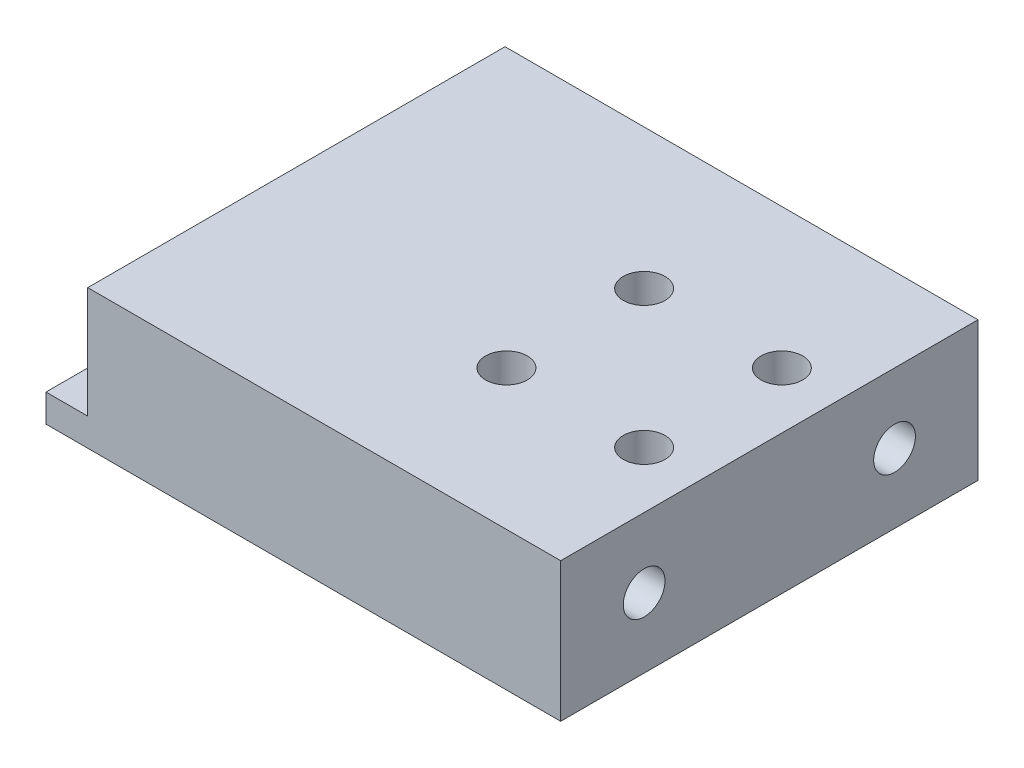
ISO-10303-21;
HEADER;
FILE_DESCRIPTION(('STEP AP214'),'2;1');
FILE_NAME('part.step','',(''),(''),'','','');
FILE_SCHEMA(('AUTOMOTIVE_DESIGN { 1 0 10303 214 1 1 1 1 }'));
ENDSEC;
DATA;
#1=APPLICATION_CONTEXT('core data for automotive mechanical design processes');
#2=APPLICATION_PROTOCOL_DEFINITION('international standard','automotive_design',2000,#1);
#3=PRODUCT_CONTEXT('',#1,'mechanical');
#4=PRODUCT('Part','Part','',(#3));
#5=PRODUCT_RELATED_PRODUCT_CATEGORY('part','',(#4));
#6=PRODUCT_DEFINITION_FORMATION('','',#4);
#7=PRODUCT_DEFINITION_CONTEXT('part definition',#1,'design');
#8=PRODUCT_DEFINITION('design','',#6,#7);
#9=PRODUCT_DEFINITION_SHAPE('','',#8);
#10=(LENGTH_UNIT() NAMED_UNIT(*) SI_UNIT(.MILLI.,.METRE.));
#11=(NAMED_UNIT(*) PLANE_ANGLE_UNIT() SI_UNIT($,.RADIAN.));
#12=(NAMED_UNIT(*) SI_UNIT($,.STERADIAN.) SOLID_ANGLE_UNIT());
#13=UNCERTAINTY_MEASURE_WITH_UNIT(LENGTH_MEASURE(1.E-05),#10,'distance_accuracy_value','');
#14=(GEOMETRIC_REPRESENTATION_CONTEXT(3) GLOBAL_UNCERTAINTY_ASSIGNED_CONTEXT((#13)) GLOBAL_UNIT_ASSIGNED_CONTEXT((#10,
#11,#12)) REPRESENTATION_CONTEXT('',''));
#15=CARTESIAN_POINT('',(0.,0.,0.));
#16=DIRECTION('',(0.,0.,1.));
#17=DIRECTION('',(1.,0.,0.));
#18=AXIS2_PLACEMENT_3D('',#15,#16,#17);
#19=CARTESIAN_POINT('',(0.,10.,0.));
#20=DIRECTION('',(0.,-1.,0.));
#21=DIRECTION('',(0.,0.,-1.));
#22=AXIS2_PLACEMENT_3D('',#19,#20,#21);
#23=PLANE('',#22);
#24=CARTESIAN_POINT('',(23.0502525316942,10.,-10.0502525316941));
#25=DIRECTION('',(0.,1.,0.));
#26=DIRECTION('',(0.,0.,1.));
#27=AXIS2_PLACEMENT_3D('',#24,#25,#26);
#28=CIRCLE('',#27,1.50000000000001);
#29=CARTESIAN_POINT('',(23.0502525316942,10.,-8.55025253169413));
#30=VERTEX_POINT('',#29);
#31=EDGE_CURVE('E160',#30,#30,#28,.T.);
#32=ORIENTED_EDGE('',*,*,#31,.F.);
#33=EDGE_LOOP('',(#32));
#34=FACE_BOUND('',#33,.T.);
#35=CARTESIAN_POINT('',(32.9497474683059,10.,-10.0502525316942));
#36=DIRECTION('',(0.,1.,0.));
#37=DIRECTION('',(0.,0.,1.));
#38=AXIS2_PLACEMENT_3D('',#35,#36,#37);
#39=CIRCLE('',#38,1.49999999999992);
#40=CARTESIAN_POINT('',(32.9497474683059,10.,-8.55025253169427));
#41=VERTEX_POINT('',#40);
#42=EDGE_CURVE('E166',#41,#41,#39,.T.);
#43=ORIENTED_EDGE('',*,*,#42,.F.);
#44=EDGE_LOOP('',(#43));
#45=FACE_BOUND('',#44,.T.);
#46=CARTESIAN_POINT('',(23.0502525316941,10.,-19.9497474683058));
#47=DIRECTION('',(0.,1.,0.));
#48=DIRECTION('',(0.,0.,1.));
#49=AXIS2_PLACEMENT_3D('',#46,#47,#48);
#50=CIRCLE('',#49,1.5);
#51=CARTESIAN_POINT('',(23.0502525316941,10.,-18.4497474683058));
#52=VERTEX_POINT('',#51);
#53=EDGE_CURVE('E172',#52,#52,#50,.T.);
#54=ORIENTED_EDGE('',*,*,#53,.F.);
#55=EDGE_LOOP('',(#54));
#56=FACE_BOUND('',#55,.T.);
#57=CARTESIAN_POINT('',(32.9497474683058,10.,-19.9497474683059));
#58=DIRECTION('',(0.,1.,0.));
#59=DIRECTION('',(0.,0.,1.));
#60=AXIS2_PLACEMENT_3D('',#57,#58,#59);
#61=CIRCLE('',#60,1.5);
#62=CARTESIAN_POINT('',(32.9497474683058,10.,-18.4497474683059));
#63=VERTEX_POINT('',#62);
#64=EDGE_CURVE('E107',#63,#63,#61,.T.);
#65=ORIENTED_EDGE('',*,*,#64,.F.);
#66=EDGE_LOOP('',(#65));
#67=FACE_BOUND('',#66,.T.);
#68=DIRECTION('',(0.,0.,-1.));
#69=VECTOR('',#68,1.);
#70=CARTESIAN_POINT('',(3.,10.,-30.));
#71=LINE('',#70,#69);
#72=CARTESIAN_POINT('',(3.,10.,0.));
#73=VERTEX_POINT('',#72);
#74=CARTESIAN_POINT('',(3.,10.,-30.));
#75=VERTEX_POINT('',#74);
#76=EDGE_CURVE('E52',#73,#75,#71,.T.);
#77=ORIENTED_EDGE('',*,*,#76,.F.);
#78=DIRECTION('',(1.,0.,0.));
#79=VECTOR('',#78,1.);
#80=CARTESIAN_POINT('',(0.,10.,0.));
#81=LINE('',#80,#79);
#82=CARTESIAN_POINT('',(37.,10.,0.));
#83=VERTEX_POINT('',#82);
#84=EDGE_CURVE('E100',#73,#83,#81,.T.);
#85=ORIENTED_EDGE('',*,*,#84,.T.);
#86=DIRECTION('',(0.,0.,-1.));
#87=VECTOR('',#86,1.);
#88=CARTESIAN_POINT('',(37.,10.,0.));
#89=LINE('',#88,#87);
#90=CARTESIAN_POINT('',(37.,10.,-30.));
#91=VERTEX_POINT('',#90);
#92=EDGE_CURVE('E61',#83,#91,#89,.T.);
#93=ORIENTED_EDGE('',*,*,#92,.T.);
#94=DIRECTION('',(-1.,0.,0.));
#95=VECTOR('',#94,1.);
#96=CARTESIAN_POINT('',(0.,10.,-30.));
#97=LINE('',#96,#95);
#98=EDGE_CURVE('E91',#91,#75,#97,.T.);
#99=ORIENTED_EDGE('',*,*,#98,.T.);
#100=EDGE_LOOP('',(#77,#85,#93,#99));
#101=FACE_BOUND('',#100,.T.);
#102=ADVANCED_FACE('F35',(#34,#45,#56,#67,#101),#23,.F.);
#103=CARTESIAN_POINT('',(0.,0.,0.));
#104=DIRECTION('',(0.,-1.,0.));
#105=DIRECTION('',(0.,0.,-1.));
#106=AXIS2_PLACEMENT_3D('',#103,#104,#105);
#107=PLANE('',#106);
#108=CARTESIAN_POINT('',(32.9497474683059,0.,-10.0502525316942));
#109=DIRECTION('',(0.,1.,0.));
#110=DIRECTION('',(0.,0.,1.));
#111=AXIS2_PLACEMENT_3D('',#108,#109,#110);
#112=CIRCLE('',#111,1.49999999999992);
#113=CARTESIAN_POINT('',(32.9497474683059,0.,-8.55025253169427));
#114=VERTEX_POINT('',#113);
#115=EDGE_CURVE('E163',#114,#114,#112,.T.);
#116=ORIENTED_EDGE('',*,*,#115,.T.);
#117=EDGE_LOOP('',(#116));
#118=FACE_BOUND('',#117,.T.);
#119=CARTESIAN_POINT('',(32.9497474683058,0.,-19.9497474683059));
#120=DIRECTION('',(0.,1.,0.));
#121=DIRECTION('',(0.,0.,1.));
#122=AXIS2_PLACEMENT_3D('',#119,#120,#121);
#123=CIRCLE('',#122,1.5);
#124=CARTESIAN_POINT('',(32.9497474683058,0.,-18.4497474683059));
#125=VERTEX_POINT('',#124);
#126=EDGE_CURVE('E111',#125,#125,#123,.T.);
#127=ORIENTED_EDGE('',*,*,#126,.T.);
#128=EDGE_LOOP('',(#127));
#129=FACE_BOUND('',#128,.T.);
#130=DIRECTION('',(0.,0.,1.));
#131=VECTOR('',#130,1.);
#132=CARTESIAN_POINT('',(0.,0.,0.));
#133=LINE('',#132,#131);
#134=CARTESIAN_POINT('',(0.,0.,-30.));
#135=VERTEX_POINT('',#134);
#136=CARTESIAN_POINT('',(0.,0.,0.));
#137=VERTEX_POINT('',#136);
#138=EDGE_CURVE('E84',#135,#137,#133,.T.);
#139=ORIENTED_EDGE('',*,*,#138,.F.);
#140=DIRECTION('',(-1.,0.,0.));
#141=VECTOR('',#140,1.);
#142=CARTESIAN_POINT('',(0.,0.,-30.));
#143=LINE('',#142,#141);
#144=CARTESIAN_POINT('',(37.,0.,-30.));
#145=VERTEX_POINT('',#144);
#146=EDGE_CURVE('E95',#145,#135,#143,.T.);
#147=ORIENTED_EDGE('',*,*,#146,.F.);
#148=DIRECTION('',(0.,0.,-1.));
#149=VECTOR('',#148,1.);
#150=CARTESIAN_POINT('',(37.,0.,0.));
#151=LINE('',#150,#149);
#152=CARTESIAN_POINT('',(37.,0.,0.));
#153=VERTEX_POINT('',#152);
#154=EDGE_CURVE('E101',#153,#145,#151,.T.);
#155=ORIENTED_EDGE('',*,*,#154,.F.);
#156=DIRECTION('',(1.,0.,0.));
#157=VECTOR('',#156,1.);
#158=CARTESIAN_POINT('',(0.,0.,0.));
#159=LINE('',#158,#157);
#160=EDGE_CURVE('E106',#137,#153,#159,.T.);
#161=ORIENTED_EDGE('',*,*,#160,.F.);
#162=EDGE_LOOP('',(#139,#147,#155,#161));
#163=FACE_BOUND('',#162,.T.);
#164=CARTESIAN_POINT('',(23.0502525316941,0.,-19.9497474683058));
#165=DIRECTION('',(0.,1.,0.));
#166=DIRECTION('',(0.,0.,1.));
#167=AXIS2_PLACEMENT_3D('',#164,#165,#166);
#168=CIRCLE('',#167,1.5);
#169=CARTESIAN_POINT('',(23.0502525316941,0.,-18.4497474683058));
#170=VERTEX_POINT('',#169);
#171=EDGE_CURVE('E169',#170,#170,#168,.T.);
#172=ORIENTED_EDGE('',*,*,#171,.T.);
#173=EDGE_LOOP('',(#172));
#174=FACE_BOUND('',#173,.T.);
#175=CARTESIAN_POINT('',(23.0502525316942,0.,-10.0502525316941));
#176=DIRECTION('',(0.,1.,0.));
#177=DIRECTION('',(0.,0.,1.));
#178=AXIS2_PLACEMENT_3D('',#175,#176,#177);
#179=CIRCLE('',#178,1.50000000000001);
#180=CARTESIAN_POINT('',(23.0502525316942,0.,-8.55025253169413));
#181=VERTEX_POINT('',#180);
#182=EDGE_CURVE('E157',#181,#181,#179,.T.);
#183=ORIENTED_EDGE('',*,*,#182,.T.);
#184=EDGE_LOOP('',(#183));
#185=FACE_BOUND('',#184,.T.);
#186=ADVANCED_FACE('F104',(#118,#129,#163,#174,#185),#107,.T.);
#187=CARTESIAN_POINT('',(0.,10.,0.));
#188=DIRECTION('',(1.,0.,0.));
#189=DIRECTION('',(0.,0.,-1.));
#190=AXIS2_PLACEMENT_3D('',#187,#188,#189);
#191=PLANE('',#190);
#192=DIRECTION('',(0.,-1.,0.));
#193=VECTOR('',#192,1.);
#194=CARTESIAN_POINT('',(0.,10.,0.));
#195=LINE('',#194,#193);
#196=CARTESIAN_POINT('',(0.,2.,0.));
#197=VERTEX_POINT('',#196);
#198=EDGE_CURVE('E11',#197,#137,#195,.T.);
#199=ORIENTED_EDGE('',*,*,#198,.F.);
#200=DIRECTION('',(0.,0.,1.));
#201=VECTOR('',#200,1.);
#202=CARTESIAN_POINT('',(0.,2.,-30.));
#203=LINE('',#202,#201);
#204=CARTESIAN_POINT('',(0.,2.,-30.));
#205=VERTEX_POINT('',#204);
#206=EDGE_CURVE('E87',#205,#197,#203,.T.);
#207=ORIENTED_EDGE('',*,*,#206,.F.);
#208=DIRECTION('',(0.,-1.,0.));
#209=VECTOR('',#208,1.);
#210=CARTESIAN_POINT('',(0.,10.,-30.));
#211=LINE('',#210,#209);
#212=EDGE_CURVE('E80',#205,#135,#211,.T.);
#213=ORIENTED_EDGE('',*,*,#212,.T.);
#214=ORIENTED_EDGE('',*,*,#138,.T.);
#215=EDGE_LOOP('',(#199,#207,#213,#214));
#216=FACE_BOUND('',#215,.T.);
#217=ADVANCED_FACE('F37',(#216),#191,.F.);
#218=CARTESIAN_POINT('',(0.,10.,0.));
#219=DIRECTION('',(0.,0.,-1.));
#220=DIRECTION('',(-1.,0.,0.));
#221=AXIS2_PLACEMENT_3D('',#218,#219,#220);
#222=PLANE('',#221);
#223=DIRECTION('',(0.,1.,0.));
#224=VECTOR('',#223,1.);
#225=CARTESIAN_POINT('',(3.,10.,0.));
#226=LINE('',#225,#224);
#227=CARTESIAN_POINT('',(3.,2.,0.));
#228=VERTEX_POINT('',#227);
#229=EDGE_CURVE('E138',#228,#73,#226,.T.);
#230=ORIENTED_EDGE('',*,*,#229,.F.);
#231=DIRECTION('',(-1.,0.,0.));
#232=VECTOR('',#231,1.);
#233=CARTESIAN_POINT('',(3.,2.,0.));
#234=LINE('',#233,#232);
#235=EDGE_CURVE('E142',#228,#197,#234,.T.);
#236=ORIENTED_EDGE('',*,*,#235,.T.);
#237=ORIENTED_EDGE('',*,*,#198,.T.);
#238=ORIENTED_EDGE('',*,*,#160,.T.);
#239=DIRECTION('',(0.,-1.,0.));
#240=VECTOR('',#239,1.);
#241=CARTESIAN_POINT('',(37.,10.,0.));
#242=LINE('',#241,#240);
#243=EDGE_CURVE('E44',#83,#153,#242,.T.);
#244=ORIENTED_EDGE('',*,*,#243,.F.);
#245=ORIENTED_EDGE('',*,*,#84,.F.);
#246=EDGE_LOOP('',(#230,#236,#237,#238,#244,#245));
#247=FACE_BOUND('',#246,.T.);
#248=ADVANCED_FACE('F194',(#247),#222,.F.);
#249=CARTESIAN_POINT('',(37.,10.,0.));
#250=DIRECTION('',(-1.,0.,0.));
#251=DIRECTION('',(0.,0.,1.));
#252=AXIS2_PLACEMENT_3D('',#249,#250,#251);
#253=PLANE('',#252);
#254=CARTESIAN_POINT('',(37.,5.,-24.));
#255=DIRECTION('',(1.,0.,0.));
#256=DIRECTION('',(0.,0.,-1.));
#257=AXIS2_PLACEMENT_3D('',#254,#255,#256);
#258=CIRCLE('',#257,1.5);
#259=CARTESIAN_POINT('',(37.,5.,-25.5));
#260=VERTEX_POINT('',#259);
#261=EDGE_CURVE('E145',#260,#260,#258,.T.);
#262=ORIENTED_EDGE('',*,*,#261,.F.);
#263=EDGE_LOOP('',(#262));
#264=FACE_BOUND('',#263,.T.);
#265=CARTESIAN_POINT('',(37.,5.,-6.));
#266=DIRECTION('',(1.,0.,0.));
#267=DIRECTION('',(0.,0.,-1.));
#268=AXIS2_PLACEMENT_3D('',#265,#266,#267);
#269=CIRCLE('',#268,1.5);
#270=CARTESIAN_POINT('',(37.,5.,-7.5));
#271=VERTEX_POINT('',#270);
#272=EDGE_CURVE('E151',#271,#271,#269,.T.);
#273=ORIENTED_EDGE('',*,*,#272,.F.);
#274=EDGE_LOOP('',(#273));
#275=FACE_BOUND('',#274,.T.);
#276=ORIENTED_EDGE('',*,*,#154,.T.);
#277=DIRECTION('',(0.,-1.,0.));
#278=VECTOR('',#277,1.);
#279=CARTESIAN_POINT('',(37.,10.,-30.));
#280=LINE('',#279,#278);
#281=EDGE_CURVE('E90',#91,#145,#280,.T.);
#282=ORIENTED_EDGE('',*,*,#281,.F.);
#283=ORIENTED_EDGE('',*,*,#92,.F.);
#284=ORIENTED_EDGE('',*,*,#243,.T.);
#285=EDGE_LOOP('',(#276,#282,#283,#284));
#286=FACE_BOUND('',#285,.T.);
#287=ADVANCED_FACE('F197',(#264,#275,#286),#253,.F.);
#288=CARTESIAN_POINT('',(0.,10.,-30.));
#289=DIRECTION('',(0.,0.,1.));
#290=DIRECTION('',(1.,0.,0.));
#291=AXIS2_PLACEMENT_3D('',#288,#289,#290);
#292=PLANE('',#291);
#293=ORIENTED_EDGE('',*,*,#212,.F.);
#294=DIRECTION('',(-1.,0.,0.));
#295=VECTOR('',#294,1.);
#296=CARTESIAN_POINT('',(3.,2.,-30.));
#297=LINE('',#296,#295);
#298=CARTESIAN_POINT('',(3.,2.,-30.));
#299=VERTEX_POINT('',#298);
#300=EDGE_CURVE('E140',#299,#205,#297,.T.);
#301=ORIENTED_EDGE('',*,*,#300,.F.);
#302=DIRECTION('',(0.,-1.,0.));
#303=VECTOR('',#302,1.);
#304=CARTESIAN_POINT('',(3.,10.,-30.));
#305=LINE('',#304,#303);
#306=EDGE_CURVE('E124',#75,#299,#305,.T.);
#307=ORIENTED_EDGE('',*,*,#306,.F.);
#308=ORIENTED_EDGE('',*,*,#98,.F.);
#309=ORIENTED_EDGE('',*,*,#281,.T.);
#310=ORIENTED_EDGE('',*,*,#146,.T.);
#311=EDGE_LOOP('',(#293,#301,#307,#308,#309,#310));
#312=FACE_BOUND('',#311,.T.);
#313=ADVANCED_FACE('F96',(#312),#292,.F.);
#314=CARTESIAN_POINT('',(32.9497474683058,10.,-19.9497474683059));
#315=DIRECTION('',(0.,-1.,0.));
#316=DIRECTION('',(0.,0.,-1.));
#317=AXIS2_PLACEMENT_3D('',#314,#315,#316);
#318=CYLINDRICAL_SURFACE('',#317,1.5);
#319=ORIENTED_EDGE('',*,*,#64,.T.);
#320=EDGE_LOOP('',(#319));
#321=FACE_BOUND('',#320,.T.);
#322=ORIENTED_EDGE('',*,*,#126,.F.);
#323=EDGE_LOOP('',(#322));
#324=FACE_BOUND('',#323,.T.);
#325=ADVANCED_FACE('F205',(#321,#324),#318,.F.);
#326=CARTESIAN_POINT('',(23.0502525316941,10.,-19.9497474683058));
#327=DIRECTION('',(0.,-1.,0.));
#328=DIRECTION('',(0.,0.,-1.));
#329=AXIS2_PLACEMENT_3D('',#326,#327,#328);
#330=CYLINDRICAL_SURFACE('',#329,1.5);
#331=ORIENTED_EDGE('',*,*,#53,.T.);
#332=EDGE_LOOP('',(#331));
#333=FACE_BOUND('',#332,.T.);
#334=ORIENTED_EDGE('',*,*,#171,.F.);
#335=EDGE_LOOP('',(#334));
#336=FACE_BOUND('',#335,.T.);
#337=ADVANCED_FACE('F222',(#333,#336),#330,.F.);
#338=CARTESIAN_POINT('',(32.9497474683059,10.,-10.0502525316942));
#339=DIRECTION('',(0.,-1.,0.));
#340=DIRECTION('',(0.,0.,-1.));
#341=AXIS2_PLACEMENT_3D('',#338,#339,#340);
#342=CYLINDRICAL_SURFACE('',#341,1.49999999999992);
#343=ORIENTED_EDGE('',*,*,#42,.T.);
#344=EDGE_LOOP('',(#343));
#345=FACE_BOUND('',#344,.T.);
#346=ORIENTED_EDGE('',*,*,#115,.F.);
#347=EDGE_LOOP('',(#346));
#348=FACE_BOUND('',#347,.T.);
#349=ADVANCED_FACE('F226',(#345,#348),#342,.F.);
#350=CARTESIAN_POINT('',(23.0502525316942,10.,-10.0502525316941));
#351=DIRECTION('',(0.,-1.,0.));
#352=DIRECTION('',(0.,0.,-1.));
#353=AXIS2_PLACEMENT_3D('',#350,#351,#352);
#354=CYLINDRICAL_SURFACE('',#353,1.50000000000001);
#355=ORIENTED_EDGE('',*,*,#31,.T.);
#356=EDGE_LOOP('',(#355));
#357=FACE_BOUND('',#356,.T.);
#358=ORIENTED_EDGE('',*,*,#182,.F.);
#359=EDGE_LOOP('',(#358));
#360=FACE_BOUND('',#359,.T.);
#361=ADVANCED_FACE('F230',(#357,#360),#354,.F.);
#362=CARTESIAN_POINT('',(31.,5.,-6.));
#363=DIRECTION('',(1.,0.,0.));
#364=DIRECTION('',(0.,0.,-1.));
#365=AXIS2_PLACEMENT_3D('',#362,#363,#364);
#366=CYLINDRICAL_SURFACE('',#365,1.5);
#367=CARTESIAN_POINT('',(31.,5.,-6.));
#368=DIRECTION('',(1.,0.,0.));
#369=DIRECTION('',(0.,0.,-1.));
#370=AXIS2_PLACEMENT_3D('',#367,#368,#369);
#371=CIRCLE('',#370,1.5);
#372=CARTESIAN_POINT('',(31.,5.,-7.5));
#373=VERTEX_POINT('',#372);
#374=EDGE_CURVE('E154',#373,#373,#371,.T.);
#375=ORIENTED_EDGE('',*,*,#374,.F.);
#376=EDGE_LOOP('',(#375));
#377=FACE_BOUND('',#376,.T.);
#378=ORIENTED_EDGE('',*,*,#272,.T.);
#379=EDGE_LOOP('',(#378));
#380=FACE_BOUND('',#379,.T.);
#381=ADVANCED_FACE('F234',(#377,#380),#366,.F.);
#382=CARTESIAN_POINT('',(31.,5.,-6.));
#383=DIRECTION('',(1.,0.,0.));
#384=DIRECTION('',(0.,0.,-1.));
#385=AXIS2_PLACEMENT_3D('',#382,#383,#384);
#386=PLANE('',#385);
#387=ORIENTED_EDGE('',*,*,#374,.T.);
#388=EDGE_LOOP('',(#387));
#389=FACE_BOUND('',#388,.T.);
#390=ADVANCED_FACE('F238',(#389),#386,.T.);
#391=CARTESIAN_POINT('',(31.,5.,-24.));
#392=DIRECTION('',(1.,0.,0.));
#393=DIRECTION('',(0.,0.,-1.));
#394=AXIS2_PLACEMENT_3D('',#391,#392,#393);
#395=CYLINDRICAL_SURFACE('',#394,1.5);
#396=CARTESIAN_POINT('',(31.,5.,-24.));
#397=DIRECTION('',(1.,0.,0.));
#398=DIRECTION('',(0.,0.,-1.));
#399=AXIS2_PLACEMENT_3D('',#396,#397,#398);
#400=CIRCLE('',#399,1.5);
#401=CARTESIAN_POINT('',(31.,5.,-25.5));
#402=VERTEX_POINT('',#401);
#403=EDGE_CURVE('E148',#402,#402,#400,.T.);
#404=ORIENTED_EDGE('',*,*,#403,.F.);
#405=EDGE_LOOP('',(#404));
#406=FACE_BOUND('',#405,.T.);
#407=ORIENTED_EDGE('',*,*,#261,.T.);
#408=EDGE_LOOP('',(#407));
#409=FACE_BOUND('',#408,.T.);
#410=ADVANCED_FACE('F242',(#406,#409),#395,.F.);
#411=CARTESIAN_POINT('',(31.,5.,-24.));
#412=DIRECTION('',(1.,0.,0.));
#413=DIRECTION('',(0.,0.,-1.));
#414=AXIS2_PLACEMENT_3D('',#411,#412,#413);
#415=PLANE('',#414);
#416=ORIENTED_EDGE('',*,*,#403,.T.);
#417=EDGE_LOOP('',(#416));
#418=FACE_BOUND('',#417,.T.);
#419=ADVANCED_FACE('F246',(#418),#415,.T.);
#420=CARTESIAN_POINT('',(3.,2.,-30.));
#421=DIRECTION('',(0.,-1.,0.));
#422=DIRECTION('',(0.,0.,-1.));
#423=AXIS2_PLACEMENT_3D('',#420,#421,#422);
#424=PLANE('',#423);
#425=ORIENTED_EDGE('',*,*,#206,.T.);
#426=ORIENTED_EDGE('',*,*,#235,.F.);
#427=DIRECTION('',(0.,0.,1.));
#428=VECTOR('',#427,1.);
#429=CARTESIAN_POINT('',(3.,2.,-30.));
#430=LINE('',#429,#428);
#431=EDGE_CURVE('E135',#299,#228,#430,.T.);
#432=ORIENTED_EDGE('',*,*,#431,.F.);
#433=ORIENTED_EDGE('',*,*,#300,.T.);
#434=EDGE_LOOP('',(#425,#426,#432,#433));
#435=FACE_BOUND('',#434,.T.);
#436=ADVANCED_FACE('F192',(#435),#424,.F.);
#437=CARTESIAN_POINT('',(3.,0.,0.));
#438=DIRECTION('',(-1.,0.,0.));
#439=DIRECTION('',(0.,0.,1.));
#440=AXIS2_PLACEMENT_3D('',#437,#438,#439);
#441=PLANE('',#440);
#442=CARTESIAN_POINT('',(3.,5.4,-10.));
#443=DIRECTION('',(-1.,0.,0.));
#444=DIRECTION('',(0.,0.,1.));
#445=AXIS2_PLACEMENT_3D('',#442,#443,#444);
#446=CIRCLE('',#445,1.);
#447=CARTESIAN_POINT('',(3.,5.4,-9.));
#448=VERTEX_POINT('',#447);
#449=EDGE_CURVE('E39',#448,#448,#446,.T.);
#450=ORIENTED_EDGE('',*,*,#449,.F.);
#451=EDGE_LOOP('',(#450));
#452=FACE_BOUND('',#451,.T.);
#453=CARTESIAN_POINT('',(3.,5.4,-20.));
#454=DIRECTION('',(-1.,0.,0.));
#455=DIRECTION('',(0.,0.,1.));
#456=AXIS2_PLACEMENT_3D('',#453,#454,#455);
#457=CIRCLE('',#456,1.);
#458=CARTESIAN_POINT('',(3.,5.4,-19.));
#459=VERTEX_POINT('',#458);
#460=EDGE_CURVE('E119',#459,#459,#457,.T.);
#461=ORIENTED_EDGE('',*,*,#460,.F.);
#462=EDGE_LOOP('',(#461));
#463=FACE_BOUND('',#462,.T.);
#464=ORIENTED_EDGE('',*,*,#306,.T.);
#465=ORIENTED_EDGE('',*,*,#431,.T.);
#466=ORIENTED_EDGE('',*,*,#229,.T.);
#467=ORIENTED_EDGE('',*,*,#76,.T.);
#468=EDGE_LOOP('',(#464,#465,#466,#467));
#469=FACE_BOUND('',#468,.T.);
#470=ADVANCED_FACE('F181',(#452,#463,#469),#441,.T.);
#471=CARTESIAN_POINT('',(7.,5.4,-20.));
#472=DIRECTION('',(-1.,0.,0.));
#473=DIRECTION('',(0.,0.,1.));
#474=AXIS2_PLACEMENT_3D('',#471,#472,#473);
#475=CYLINDRICAL_SURFACE('',#474,1.);
#476=ORIENTED_EDGE('',*,*,#460,.T.);
#477=EDGE_LOOP('',(#476));
#478=FACE_BOUND('',#477,.T.);
#479=CARTESIAN_POINT('',(7.,5.4,-20.));
#480=DIRECTION('',(-1.,0.,0.));
#481=DIRECTION('',(0.,0.,1.));
#482=AXIS2_PLACEMENT_3D('',#479,#480,#481);
#483=CIRCLE('',#482,1.);
#484=CARTESIAN_POINT('',(7.,5.4,-19.));
#485=VERTEX_POINT('',#484);
#486=EDGE_CURVE('E121',#485,#485,#483,.T.);
#487=ORIENTED_EDGE('',*,*,#486,.F.);
#488=EDGE_LOOP('',(#487));
#489=FACE_BOUND('',#488,.T.);
#490=ADVANCED_FACE('F255',(#478,#489),#475,.F.);
#491=CARTESIAN_POINT('',(7.,5.4,-20.));
#492=DIRECTION('',(-1.,0.,0.));
#493=DIRECTION('',(0.,0.,1.));
#494=AXIS2_PLACEMENT_3D('',#491,#492,#493);
#495=PLANE('',#494);
#496=ORIENTED_EDGE('',*,*,#486,.T.);
#497=EDGE_LOOP('',(#496));
#498=FACE_BOUND('',#497,.T.);
#499=ADVANCED_FACE('F259',(#498),#495,.T.);
#500=CARTESIAN_POINT('',(7.,5.4,-10.));
#501=DIRECTION('',(-1.,0.,0.));
#502=DIRECTION('',(0.,0.,1.));
#503=AXIS2_PLACEMENT_3D('',#500,#501,#502);
#504=CYLINDRICAL_SURFACE('',#503,1.);
#505=ORIENTED_EDGE('',*,*,#449,.T.);
#506=EDGE_LOOP('',(#505));
#507=FACE_BOUND('',#506,.T.);
#508=CARTESIAN_POINT('',(7.,5.4,-10.));
#509=DIRECTION('',(-1.,0.,0.));
#510=DIRECTION('',(0.,0.,1.));
#511=AXIS2_PLACEMENT_3D('',#508,#509,#510);
#512=CIRCLE('',#511,1.);
#513=CARTESIAN_POINT('',(7.,5.4,-9.));
#514=VERTEX_POINT('',#513);
#515=EDGE_CURVE('E131',#514,#514,#512,.T.);
#516=ORIENTED_EDGE('',*,*,#515,.F.);
#517=EDGE_LOOP('',(#516));
#518=FACE_BOUND('',#517,.T.);
#519=ADVANCED_FACE('F262',(#507,#518),#504,.F.);
#520=CARTESIAN_POINT('',(7.,5.4,-10.));
#521=DIRECTION('',(-1.,0.,0.));
#522=DIRECTION('',(0.,0.,1.));
#523=AXIS2_PLACEMENT_3D('',#520,#521,#522);
#524=PLANE('',#523);
#525=ORIENTED_EDGE('',*,*,#515,.T.);
#526=EDGE_LOOP('',(#525));
#527=FACE_BOUND('',#526,.T.);
#528=ADVANCED_FACE('F265',(#527),#524,.T.);
#529=CLOSED_SHELL('',(#102,#186,#217,#248,#287,#313,#325,#337,#349,#361,#381,#390,#410,#419,
#436,#470,#490,#499,#519,#528));
#530=MANIFOLD_SOLID_BREP('B2',#529);
#531=ADVANCED_BREP_SHAPE_REPRESENTATION('',(#18,#530),#14);
#532=SHAPE_DEFINITION_REPRESENTATION(#9,#531);
ENDSEC;
END-ISO-10303-21;
